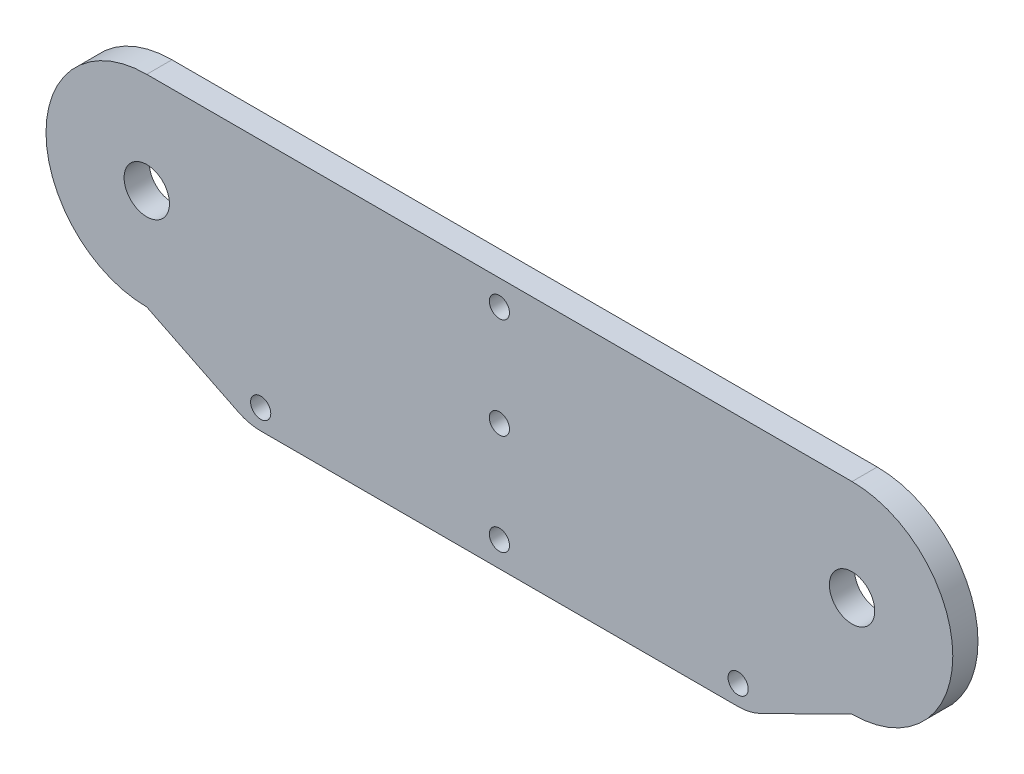
ISO-10303-21;
HEADER;
FILE_DESCRIPTION(('STEP AP214'),'2;1');
FILE_NAME('part.step','',(''),(''),'','','');
FILE_SCHEMA(('AUTOMOTIVE_DESIGN { 1 0 10303 214 1 1 1 1 }'));
ENDSEC;
DATA;
#1=APPLICATION_CONTEXT('core data for automotive mechanical design processes');
#2=APPLICATION_PROTOCOL_DEFINITION('international standard','automotive_design',2000,#1);
#3=PRODUCT_CONTEXT('',#1,'mechanical');
#4=PRODUCT('Part','Part','',(#3));
#5=PRODUCT_RELATED_PRODUCT_CATEGORY('part','',(#4));
#6=PRODUCT_DEFINITION_FORMATION('','',#4);
#7=PRODUCT_DEFINITION_CONTEXT('part definition',#1,'design');
#8=PRODUCT_DEFINITION('design','',#6,#7);
#9=PRODUCT_DEFINITION_SHAPE('','',#8);
#10=(LENGTH_UNIT() NAMED_UNIT(*) SI_UNIT(.MILLI.,.METRE.));
#11=(NAMED_UNIT(*) PLANE_ANGLE_UNIT() SI_UNIT($,.RADIAN.));
#12=(NAMED_UNIT(*) SI_UNIT($,.STERADIAN.) SOLID_ANGLE_UNIT());
#13=UNCERTAINTY_MEASURE_WITH_UNIT(LENGTH_MEASURE(1.E-05),#10,'distance_accuracy_value','');
#14=(GEOMETRIC_REPRESENTATION_CONTEXT(3) GLOBAL_UNCERTAINTY_ASSIGNED_CONTEXT((#13)) GLOBAL_UNIT_ASSIGNED_CONTEXT((#10,
#11,#12)) REPRESENTATION_CONTEXT('',''));
#15=CARTESIAN_POINT('',(0.,0.,0.));
#16=DIRECTION('',(0.,0.,1.));
#17=DIRECTION('',(1.,0.,0.));
#18=AXIS2_PLACEMENT_3D('',#15,#16,#17);
#19=CARTESIAN_POINT('',(35.3056329995053,-71.6141290487414,5.));
#20=DIRECTION('',(0.442182430618627,-0.89692513514351,0.));
#21=DIRECTION('',(0.89692513514351,0.442182430618627,0.));
#22=AXIS2_PLACEMENT_3D('',#19,#20,#21);
#23=PLANE('',#22);
#24=DIRECTION('',(-0.89692513514351,-0.442182430618627,0.));
#25=VECTOR('',#24,1.);
#26=CARTESIAN_POINT('',(35.3056329995053,-71.6141290487414,0.));
#27=LINE('',#26,#25);
#28=CARTESIAN_POINT('',(140.,-19.9999999999995,0.));
#29=VERTEX_POINT('',#28);
#30=CARTESIAN_POINT('',(121.806724049919,-28.969251351435,0.));
#31=VERTEX_POINT('',#30);
#32=EDGE_CURVE('E167',#29,#31,#27,.T.);
#33=ORIENTED_EDGE('',*,*,#32,.F.);
#34=DIRECTION('',(0.,0.,-1.));
#35=VECTOR('',#34,1.);
#36=CARTESIAN_POINT('',(140.,-19.9999999999995,5.));
#37=LINE('',#36,#35);
#38=CARTESIAN_POINT('',(140.,-19.9999999999995,5.));
#39=VERTEX_POINT('',#38);
#40=EDGE_CURVE('E11',#39,#29,#37,.T.);
#41=ORIENTED_EDGE('',*,*,#40,.F.);
#42=DIRECTION('',(-0.89692513514351,-0.442182430618627,0.));
#43=VECTOR('',#42,1.);
#44=CARTESIAN_POINT('',(35.3056329995053,-71.6141290487414,5.));
#45=LINE('',#44,#43);
#46=CARTESIAN_POINT('',(121.806724049919,-28.969251351435,5.));
#47=VERTEX_POINT('',#46);
#48=EDGE_CURVE('E214',#39,#47,#45,.T.);
#49=ORIENTED_EDGE('',*,*,#48,.T.);
#50=DIRECTION('',(0.,0.,-1.));
#51=VECTOR('',#50,1.);
#52=CARTESIAN_POINT('',(121.806724049919,-28.969251351435,5.));
#53=LINE('',#52,#51);
#54=EDGE_CURVE('E98',#47,#31,#53,.T.);
#55=ORIENTED_EDGE('',*,*,#54,.T.);
#56=EDGE_LOOP('',(#33,#41,#49,#55));
#57=FACE_BOUND('',#56,.T.);
#58=ADVANCED_FACE('F47',(#57),#23,.T.);
#59=CARTESIAN_POINT('',(140.,0.,5.));
#60=DIRECTION('',(0.,0.,-1.));
#61=DIRECTION('',(-1.,0.,0.));
#62=AXIS2_PLACEMENT_3D('',#59,#60,#61);
#63=CYLINDRICAL_SURFACE('',#62,20.0000000000002);
#64=CARTESIAN_POINT('',(140.,0.,0.));
#65=DIRECTION('',(0.,0.,1.));
#66=DIRECTION('',(1.,0.,0.));
#67=AXIS2_PLACEMENT_3D('',#64,#65,#66);
#68=CIRCLE('',#67,20.0000000000002);
#69=CARTESIAN_POINT('',(140.,20.0000000000002,0.));
#70=VERTEX_POINT('',#69);
#71=EDGE_CURVE('E171',#70,#29,#68,.F.);
#72=ORIENTED_EDGE('',*,*,#71,.F.);
#73=DIRECTION('',(0.,0.,-1.));
#74=VECTOR('',#73,1.);
#75=CARTESIAN_POINT('',(140.,20.0000000000002,5.));
#76=LINE('',#75,#74);
#77=CARTESIAN_POINT('',(140.,20.0000000000002,5.));
#78=VERTEX_POINT('',#77);
#79=EDGE_CURVE('E56',#78,#70,#76,.T.);
#80=ORIENTED_EDGE('',*,*,#79,.F.);
#81=CARTESIAN_POINT('',(140.,0.,5.));
#82=DIRECTION('',(0.,0.,1.));
#83=DIRECTION('',(1.,0.,0.));
#84=AXIS2_PLACEMENT_3D('',#81,#82,#83);
#85=CIRCLE('',#84,20.0000000000002);
#86=EDGE_CURVE('E254',#78,#39,#85,.F.);
#87=ORIENTED_EDGE('',*,*,#86,.T.);
#88=ORIENTED_EDGE('',*,*,#40,.T.);
#89=EDGE_LOOP('',(#72,#80,#87,#88));
#90=FACE_BOUND('',#89,.T.);
#91=ADVANCED_FACE('F238',(#90),#63,.T.);
#92=CARTESIAN_POINT('',(0.,20.,5.));
#93=DIRECTION('',(0.,1.,0.));
#94=DIRECTION('',(-1.,0.,0.));
#95=AXIS2_PLACEMENT_3D('',#92,#93,#94);
#96=PLANE('',#95);
#97=DIRECTION('',(1.,0.,0.));
#98=VECTOR('',#97,1.);
#99=CARTESIAN_POINT('',(0.,20.,0.));
#100=LINE('',#99,#98);
#101=CARTESIAN_POINT('',(0.,20.,0.));
#102=VERTEX_POINT('',#101);
#103=EDGE_CURVE('E176',#102,#70,#100,.T.);
#104=ORIENTED_EDGE('',*,*,#103,.F.);
#105=DIRECTION('',(0.,0.,-1.));
#106=VECTOR('',#105,1.);
#107=CARTESIAN_POINT('',(0.,20.,5.));
#108=LINE('',#107,#106);
#109=CARTESIAN_POINT('',(0.,20.,5.));
#110=VERTEX_POINT('',#109);
#111=EDGE_CURVE('E225',#110,#102,#108,.T.);
#112=ORIENTED_EDGE('',*,*,#111,.F.);
#113=DIRECTION('',(1.,0.,0.));
#114=VECTOR('',#113,1.);
#115=CARTESIAN_POINT('',(0.,20.,5.));
#116=LINE('',#115,#114);
#117=EDGE_CURVE('E234',#110,#78,#116,.T.);
#118=ORIENTED_EDGE('',*,*,#117,.T.);
#119=ORIENTED_EDGE('',*,*,#79,.T.);
#120=EDGE_LOOP('',(#104,#112,#118,#119));
#121=FACE_BOUND('',#120,.T.);
#122=ADVANCED_FACE('F232',(#121),#96,.T.);
#123=CARTESIAN_POINT('',(0.,0.,5.));
#124=DIRECTION('',(0.,0.,-1.));
#125=DIRECTION('',(-1.,0.,0.));
#126=AXIS2_PLACEMENT_3D('',#123,#124,#125);
#127=CYLINDRICAL_SURFACE('',#126,20.);
#128=CARTESIAN_POINT('',(0.,0.,0.));
#129=DIRECTION('',(0.,0.,1.));
#130=DIRECTION('',(1.,0.,0.));
#131=AXIS2_PLACEMENT_3D('',#128,#129,#130);
#132=CIRCLE('',#131,20.);
#133=CARTESIAN_POINT('',(0.,-20.,0.));
#134=VERTEX_POINT('',#133);
#135=EDGE_CURVE('E180',#102,#134,#132,.T.);
#136=ORIENTED_EDGE('',*,*,#135,.T.);
#137=DIRECTION('',(0.,0.,-1.));
#138=VECTOR('',#137,1.);
#139=CARTESIAN_POINT('',(0.,-20.,5.));
#140=LINE('',#139,#138);
#141=CARTESIAN_POINT('',(0.,-20.,5.));
#142=VERTEX_POINT('',#141);
#143=EDGE_CURVE('E221',#142,#134,#140,.T.);
#144=ORIENTED_EDGE('',*,*,#143,.F.);
#145=CARTESIAN_POINT('',(0.,0.,5.));
#146=DIRECTION('',(0.,0.,1.));
#147=DIRECTION('',(1.,0.,0.));
#148=AXIS2_PLACEMENT_3D('',#145,#146,#147);
#149=CIRCLE('',#148,20.);
#150=EDGE_CURVE('E141',#110,#142,#149,.T.);
#151=ORIENTED_EDGE('',*,*,#150,.F.);
#152=ORIENTED_EDGE('',*,*,#111,.T.);
#153=EDGE_LOOP('',(#136,#144,#151,#152));
#154=FACE_BOUND('',#153,.T.);
#155=ADVANCED_FACE('F246',(#154),#127,.T.);
#156=CARTESIAN_POINT('',(-7.93209072681373,-16.0894939610443,5.));
#157=DIRECTION('',(0.442182430618611,0.896925135143518,0.));
#158=DIRECTION('',(-0.896925135143518,0.442182430618611,0.));
#159=AXIS2_PLACEMENT_3D('',#156,#157,#158);
#160=PLANE('',#159);
#161=DIRECTION('',(0.896925135143518,-0.442182430618611,0.));
#162=VECTOR('',#161,1.);
#163=CARTESIAN_POINT('',(-7.93209072681373,-16.0894939610443,0.));
#164=LINE('',#163,#162);
#165=CARTESIAN_POINT('',(18.1932759500815,-28.9692513514352,0.));
#166=VERTEX_POINT('',#165);
#167=EDGE_CURVE('E183',#134,#166,#164,.T.);
#168=ORIENTED_EDGE('',*,*,#167,.T.);
#169=DIRECTION('',(0.,0.,-1.));
#170=VECTOR('',#169,1.);
#171=CARTESIAN_POINT('',(18.1932759500815,-28.9692513514352,5.));
#172=LINE('',#171,#170);
#173=CARTESIAN_POINT('',(18.1932759500815,-28.9692513514352,5.));
#174=VERTEX_POINT('',#173);
#175=EDGE_CURVE('E126',#174,#166,#172,.T.);
#176=ORIENTED_EDGE('',*,*,#175,.F.);
#177=DIRECTION('',(0.896925135143518,-0.442182430618611,0.));
#178=VECTOR('',#177,1.);
#179=CARTESIAN_POINT('',(-7.93209072681373,-16.0894939610443,5.));
#180=LINE('',#179,#178);
#181=EDGE_CURVE('E136',#142,#174,#180,.T.);
#182=ORIENTED_EDGE('',*,*,#181,.F.);
#183=ORIENTED_EDGE('',*,*,#143,.T.);
#184=EDGE_LOOP('',(#168,#176,#182,#183));
#185=FACE_BOUND('',#184,.T.);
#186=ADVANCED_FACE('F249',(#185),#160,.F.);
#187=CARTESIAN_POINT('',(22.6151002562676,-20.,5.));
#188=DIRECTION('',(0.,0.,-1.));
#189=DIRECTION('',(-1.,0.,0.));
#190=AXIS2_PLACEMENT_3D('',#187,#188,#189);
#191=CYLINDRICAL_SURFACE('',#190,10.);
#192=CARTESIAN_POINT('',(22.6151002562676,-20.,0.));
#193=DIRECTION('',(0.,0.,1.));
#194=DIRECTION('',(1.,0.,0.));
#195=AXIS2_PLACEMENT_3D('',#192,#193,#194);
#196=CIRCLE('',#195,10.);
#197=CARTESIAN_POINT('',(22.6151002562677,-30.,0.));
#198=VERTEX_POINT('',#197);
#199=EDGE_CURVE('E124',#198,#166,#196,.F.);
#200=ORIENTED_EDGE('',*,*,#199,.F.);
#201=DIRECTION('',(0.,0.,-1.));
#202=VECTOR('',#201,1.);
#203=CARTESIAN_POINT('',(22.6151002562677,-30.,5.));
#204=LINE('',#203,#202);
#205=CARTESIAN_POINT('',(22.6151002562677,-30.,5.));
#206=VERTEX_POINT('',#205);
#207=EDGE_CURVE('E118',#206,#198,#204,.T.);
#208=ORIENTED_EDGE('',*,*,#207,.F.);
#209=CARTESIAN_POINT('',(22.6151002562676,-20.,5.));
#210=DIRECTION('',(0.,0.,1.));
#211=DIRECTION('',(1.,0.,0.));
#212=AXIS2_PLACEMENT_3D('',#209,#210,#211);
#213=CIRCLE('',#212,10.);
#214=EDGE_CURVE('E122',#206,#174,#213,.F.);
#215=ORIENTED_EDGE('',*,*,#214,.T.);
#216=ORIENTED_EDGE('',*,*,#175,.T.);
#217=EDGE_LOOP('',(#200,#208,#215,#216));
#218=FACE_BOUND('',#217,.T.);
#219=ADVANCED_FACE('F120',(#218),#191,.T.);
#220=CARTESIAN_POINT('',(1.33989687778435E-13,-30.0000000000001,5.));
#221=DIRECTION('',(0.,1.,0.));
#222=DIRECTION('',(-1.,0.,0.));
#223=AXIS2_PLACEMENT_3D('',#220,#221,#222);
#224=PLANE('',#223);
#225=DIRECTION('',(1.,0.,0.));
#226=VECTOR('',#225,1.);
#227=CARTESIAN_POINT('',(1.33989687778435E-13,-30.0000000000001,0.));
#228=LINE('',#227,#226);
#229=CARTESIAN_POINT('',(117.384899743733,-29.9999999999996,0.));
#230=VERTEX_POINT('',#229);
#231=EDGE_CURVE('E91',#198,#230,#228,.T.);
#232=ORIENTED_EDGE('',*,*,#231,.T.);
#233=DIRECTION('',(0.,0.,-1.));
#234=VECTOR('',#233,1.);
#235=CARTESIAN_POINT('',(117.384899743733,-29.9999999999996,5.));
#236=LINE('',#235,#234);
#237=CARTESIAN_POINT('',(117.384899743733,-29.9999999999996,5.));
#238=VERTEX_POINT('',#237);
#239=EDGE_CURVE('E127',#238,#230,#236,.T.);
#240=ORIENTED_EDGE('',*,*,#239,.F.);
#241=DIRECTION('',(1.,0.,0.));
#242=VECTOR('',#241,1.);
#243=CARTESIAN_POINT('',(1.33989687778435E-13,-30.0000000000001,5.));
#244=LINE('',#243,#242);
#245=EDGE_CURVE('E129',#206,#238,#244,.T.);
#246=ORIENTED_EDGE('',*,*,#245,.F.);
#247=ORIENTED_EDGE('',*,*,#207,.T.);
#248=EDGE_LOOP('',(#232,#240,#246,#247));
#249=FACE_BOUND('',#248,.T.);
#250=ADVANCED_FACE('F130',(#249),#224,.F.);
#251=CARTESIAN_POINT('',(70.,15.,5.));
#252=DIRECTION('',(0.,0.,-1.));
#253=DIRECTION('',(-1.,0.,0.));
#254=AXIS2_PLACEMENT_3D('',#251,#252,#253);
#255=CYLINDRICAL_SURFACE('',#254,2.);
#256=CARTESIAN_POINT('',(70.,15.,5.));
#257=DIRECTION('',(0.,0.,1.));
#258=DIRECTION('',(1.,0.,0.));
#259=AXIS2_PLACEMENT_3D('',#256,#257,#258);
#260=CIRCLE('',#259,2.);
#261=CARTESIAN_POINT('',(72.,15.,5.));
#262=VERTEX_POINT('',#261);
#263=EDGE_CURVE('E159',#262,#262,#260,.T.);
#264=ORIENTED_EDGE('',*,*,#263,.T.);
#265=EDGE_LOOP('',(#264));
#266=FACE_BOUND('',#265,.T.);
#267=CARTESIAN_POINT('',(70.,15.,0.));
#268=DIRECTION('',(0.,0.,1.));
#269=DIRECTION('',(1.,0.,0.));
#270=AXIS2_PLACEMENT_3D('',#267,#268,#269);
#271=CIRCLE('',#270,2.);
#272=CARTESIAN_POINT('',(72.,15.,0.));
#273=VERTEX_POINT('',#272);
#274=EDGE_CURVE('E206',#273,#273,#271,.T.);
#275=ORIENTED_EDGE('',*,*,#274,.F.);
#276=EDGE_LOOP('',(#275));
#277=FACE_BOUND('',#276,.T.);
#278=ADVANCED_FACE('F318',(#266,#277),#255,.F.);
#279=CARTESIAN_POINT('',(70.,-4.99999999999744,5.));
#280=DIRECTION('',(0.,0.,-1.));
#281=DIRECTION('',(-1.,0.,0.));
#282=AXIS2_PLACEMENT_3D('',#279,#280,#281);
#283=CYLINDRICAL_SURFACE('',#282,2.);
#284=CARTESIAN_POINT('',(70.,-4.99999999999744,5.));
#285=DIRECTION('',(0.,0.,1.));
#286=DIRECTION('',(1.,0.,0.));
#287=AXIS2_PLACEMENT_3D('',#284,#285,#286);
#288=CIRCLE('',#287,2.);
#289=CARTESIAN_POINT('',(72.,-4.99999999999744,5.));
#290=VERTEX_POINT('',#289);
#291=EDGE_CURVE('E155',#290,#290,#288,.T.);
#292=ORIENTED_EDGE('',*,*,#291,.T.);
#293=EDGE_LOOP('',(#292));
#294=FACE_BOUND('',#293,.T.);
#295=CARTESIAN_POINT('',(70.,-4.99999999999744,0.));
#296=DIRECTION('',(0.,0.,1.));
#297=DIRECTION('',(1.,0.,0.));
#298=AXIS2_PLACEMENT_3D('',#295,#296,#297);
#299=CIRCLE('',#298,2.);
#300=CARTESIAN_POINT('',(72.,-4.99999999999744,0.));
#301=VERTEX_POINT('',#300);
#302=EDGE_CURVE('E202',#301,#301,#299,.T.);
#303=ORIENTED_EDGE('',*,*,#302,.F.);
#304=EDGE_LOOP('',(#303));
#305=FACE_BOUND('',#304,.T.);
#306=ADVANCED_FACE('F328',(#294,#305),#283,.F.);
#307=CARTESIAN_POINT('',(70.,-25.,5.));
#308=DIRECTION('',(0.,0.,-1.));
#309=DIRECTION('',(-1.,0.,0.));
#310=AXIS2_PLACEMENT_3D('',#307,#308,#309);
#311=CYLINDRICAL_SURFACE('',#310,2.);
#312=CARTESIAN_POINT('',(70.,-25.,5.));
#313=DIRECTION('',(0.,0.,1.));
#314=DIRECTION('',(1.,0.,0.));
#315=AXIS2_PLACEMENT_3D('',#312,#313,#314);
#316=CIRCLE('',#315,2.);
#317=CARTESIAN_POINT('',(72.,-25.,5.));
#318=VERTEX_POINT('',#317);
#319=EDGE_CURVE('E151',#318,#318,#316,.T.);
#320=ORIENTED_EDGE('',*,*,#319,.T.);
#321=EDGE_LOOP('',(#320));
#322=FACE_BOUND('',#321,.T.);
#323=CARTESIAN_POINT('',(70.,-25.,0.));
#324=DIRECTION('',(0.,0.,1.));
#325=DIRECTION('',(1.,0.,0.));
#326=AXIS2_PLACEMENT_3D('',#323,#324,#325);
#327=CIRCLE('',#326,2.);
#328=CARTESIAN_POINT('',(72.,-25.,0.));
#329=VERTEX_POINT('',#328);
#330=EDGE_CURVE('E198',#329,#329,#327,.T.);
#331=ORIENTED_EDGE('',*,*,#330,.F.);
#332=EDGE_LOOP('',(#331));
#333=FACE_BOUND('',#332,.T.);
#334=ADVANCED_FACE('F324',(#322,#333),#311,.F.);
#335=CARTESIAN_POINT('',(140.,0.,5.));
#336=DIRECTION('',(0.,0.,-1.));
#337=DIRECTION('',(-1.,0.,0.));
#338=AXIS2_PLACEMENT_3D('',#335,#336,#337);
#339=CYLINDRICAL_SURFACE('',#338,4.50000000000015);
#340=CARTESIAN_POINT('',(140.,0.,5.));
#341=DIRECTION('',(0.,0.,1.));
#342=DIRECTION('',(1.,0.,0.));
#343=AXIS2_PLACEMENT_3D('',#340,#341,#342);
#344=CIRCLE('',#343,4.50000000000015);
#345=CARTESIAN_POINT('',(144.5,0.,5.));
#346=VERTEX_POINT('',#345);
#347=EDGE_CURVE('E147',#346,#346,#344,.F.);
#348=ORIENTED_EDGE('',*,*,#347,.F.);
#349=EDGE_LOOP('',(#348));
#350=FACE_BOUND('',#349,.T.);
#351=CARTESIAN_POINT('',(140.,0.,0.));
#352=DIRECTION('',(0.,0.,1.));
#353=DIRECTION('',(1.,0.,0.));
#354=AXIS2_PLACEMENT_3D('',#351,#352,#353);
#355=CIRCLE('',#354,4.50000000000015);
#356=CARTESIAN_POINT('',(144.5,0.,0.));
#357=VERTEX_POINT('',#356);
#358=EDGE_CURVE('E194',#357,#357,#355,.F.);
#359=ORIENTED_EDGE('',*,*,#358,.T.);
#360=EDGE_LOOP('',(#359));
#361=FACE_BOUND('',#360,.T.);
#362=ADVANCED_FACE('F321',(#350,#361),#339,.F.);
#363=CARTESIAN_POINT('',(117.384899743733,-19.9999999999996,5.));
#364=DIRECTION('',(0.,0.,-1.));
#365=DIRECTION('',(-1.,0.,0.));
#366=AXIS2_PLACEMENT_3D('',#363,#364,#365);
#367=CYLINDRICAL_SURFACE('',#366,10.0000000000002);
#368=CARTESIAN_POINT('',(117.384899743733,-19.9999999999996,0.));
#369=DIRECTION('',(0.,0.,1.));
#370=DIRECTION('',(1.,0.,0.));
#371=AXIS2_PLACEMENT_3D('',#368,#369,#370);
#372=CIRCLE('',#371,10.0000000000002);
#373=EDGE_CURVE('E191',#230,#31,#372,.T.);
#374=ORIENTED_EDGE('',*,*,#373,.T.);
#375=ORIENTED_EDGE('',*,*,#54,.F.);
#376=CARTESIAN_POINT('',(117.384899743733,-19.9999999999996,5.));
#377=DIRECTION('',(0.,0.,1.));
#378=DIRECTION('',(1.,0.,0.));
#379=AXIS2_PLACEMENT_3D('',#376,#377,#378);
#380=CIRCLE('',#379,10.0000000000002);
#381=EDGE_CURVE('E64',#238,#47,#380,.T.);
#382=ORIENTED_EDGE('',*,*,#381,.F.);
#383=ORIENTED_EDGE('',*,*,#239,.T.);
#384=EDGE_LOOP('',(#374,#375,#382,#383));
#385=FACE_BOUND('',#384,.T.);
#386=ADVANCED_FACE('F252',(#385),#367,.T.);
#387=CARTESIAN_POINT('',(0.,0.,5.));
#388=DIRECTION('',(0.,0.,-1.));
#389=DIRECTION('',(-1.,0.,0.));
#390=AXIS2_PLACEMENT_3D('',#387,#388,#389);
#391=CYLINDRICAL_SURFACE('',#390,4.5);
#392=CARTESIAN_POINT('',(0.,0.,5.));
#393=DIRECTION('',(0.,0.,1.));
#394=DIRECTION('',(1.,0.,0.));
#395=AXIS2_PLACEMENT_3D('',#392,#393,#394);
#396=CIRCLE('',#395,4.5);
#397=CARTESIAN_POINT('',(4.5,0.,5.));
#398=VERTEX_POINT('',#397);
#399=EDGE_CURVE('E163',#398,#398,#396,.T.);
#400=ORIENTED_EDGE('',*,*,#399,.T.);
#401=EDGE_LOOP('',(#400));
#402=FACE_BOUND('',#401,.T.);
#403=CARTESIAN_POINT('',(0.,0.,0.));
#404=DIRECTION('',(0.,0.,1.));
#405=DIRECTION('',(1.,0.,0.));
#406=AXIS2_PLACEMENT_3D('',#403,#404,#405);
#407=CIRCLE('',#406,4.5);
#408=CARTESIAN_POINT('',(4.5,0.,0.));
#409=VERTEX_POINT('',#408);
#410=EDGE_CURVE('E210',#409,#409,#407,.T.);
#411=ORIENTED_EDGE('',*,*,#410,.F.);
#412=EDGE_LOOP('',(#411));
#413=FACE_BOUND('',#412,.T.);
#414=ADVANCED_FACE('F289',(#402,#413),#391,.F.);
#415=CARTESIAN_POINT('',(0.,0.,5.));
#416=DIRECTION('',(0.,0.,1.));
#417=DIRECTION('',(1.,0.,0.));
#418=AXIS2_PLACEMENT_3D('',#415,#416,#417);
#419=PLANE('',#418);
#420=CARTESIAN_POINT('',(22.6151002562676,-26.,5.));
#421=DIRECTION('',(0.,0.,1.));
#422=DIRECTION('',(1.,0.,0.));
#423=AXIS2_PLACEMENT_3D('',#420,#421,#422);
#424=CIRCLE('',#423,2.);
#425=CARTESIAN_POINT('',(24.6151002562676,-26.,5.));
#426=VERTEX_POINT('',#425);
#427=EDGE_CURVE('E270',#426,#426,#424,.T.);
#428=ORIENTED_EDGE('',*,*,#427,.F.);
#429=EDGE_LOOP('',(#428));
#430=FACE_BOUND('',#429,.T.);
#431=CARTESIAN_POINT('',(117.384899743733,-26.,5.));
#432=DIRECTION('',(0.,0.,1.));
#433=DIRECTION('',(1.,0.,0.));
#434=AXIS2_PLACEMENT_3D('',#431,#432,#433);
#435=CIRCLE('',#434,2.);
#436=CARTESIAN_POINT('',(119.384899743733,-26.,5.));
#437=VERTEX_POINT('',#436);
#438=EDGE_CURVE('E266',#437,#437,#435,.T.);
#439=ORIENTED_EDGE('',*,*,#438,.F.);
#440=EDGE_LOOP('',(#439));
#441=FACE_BOUND('',#440,.T.);
#442=ORIENTED_EDGE('',*,*,#48,.F.);
#443=ORIENTED_EDGE('',*,*,#86,.F.);
#444=ORIENTED_EDGE('',*,*,#117,.F.);
#445=ORIENTED_EDGE('',*,*,#150,.T.);
#446=ORIENTED_EDGE('',*,*,#181,.T.);
#447=ORIENTED_EDGE('',*,*,#214,.F.);
#448=ORIENTED_EDGE('',*,*,#245,.T.);
#449=ORIENTED_EDGE('',*,*,#381,.T.);
#450=EDGE_LOOP('',(#442,#443,#444,#445,#446,#447,#448,#449));
#451=FACE_BOUND('',#450,.T.);
#452=ORIENTED_EDGE('',*,*,#347,.T.);
#453=EDGE_LOOP('',(#452));
#454=FACE_BOUND('',#453,.T.);
#455=ORIENTED_EDGE('',*,*,#319,.F.);
#456=EDGE_LOOP('',(#455));
#457=FACE_BOUND('',#456,.T.);
#458=ORIENTED_EDGE('',*,*,#291,.F.);
#459=EDGE_LOOP('',(#458));
#460=FACE_BOUND('',#459,.T.);
#461=ORIENTED_EDGE('',*,*,#263,.F.);
#462=EDGE_LOOP('',(#461));
#463=FACE_BOUND('',#462,.T.);
#464=ORIENTED_EDGE('',*,*,#399,.F.);
#465=EDGE_LOOP('',(#464));
#466=FACE_BOUND('',#465,.T.);
#467=ADVANCED_FACE('F133',(#430,#441,#451,#454,#457,#460,#463,#466),#419,.T.);
#468=CARTESIAN_POINT('',(0.,0.,0.));
#469=DIRECTION('',(0.,0.,1.));
#470=DIRECTION('',(1.,0.,0.));
#471=AXIS2_PLACEMENT_3D('',#468,#469,#470);
#472=PLANE('',#471);
#473=CARTESIAN_POINT('',(22.6151002562676,-26.,0.));
#474=DIRECTION('',(0.,0.,1.));
#475=DIRECTION('',(1.,0.,0.));
#476=AXIS2_PLACEMENT_3D('',#473,#474,#475);
#477=CIRCLE('',#476,2.);
#478=CARTESIAN_POINT('',(24.6151002562676,-26.,0.));
#479=VERTEX_POINT('',#478);
#480=EDGE_CURVE('E172',#479,#479,#477,.T.);
#481=ORIENTED_EDGE('',*,*,#480,.T.);
#482=EDGE_LOOP('',(#481));
#483=FACE_BOUND('',#482,.T.);
#484=CARTESIAN_POINT('',(117.384899743733,-26.,0.));
#485=DIRECTION('',(0.,0.,1.));
#486=DIRECTION('',(1.,0.,0.));
#487=AXIS2_PLACEMENT_3D('',#484,#485,#486);
#488=CIRCLE('',#487,2.);
#489=CARTESIAN_POINT('',(119.384899743733,-26.,0.));
#490=VERTEX_POINT('',#489);
#491=EDGE_CURVE('E259',#490,#490,#488,.T.);
#492=ORIENTED_EDGE('',*,*,#491,.T.);
#493=EDGE_LOOP('',(#492));
#494=FACE_BOUND('',#493,.T.);
#495=ORIENTED_EDGE('',*,*,#32,.T.);
#496=ORIENTED_EDGE('',*,*,#373,.F.);
#497=ORIENTED_EDGE('',*,*,#231,.F.);
#498=ORIENTED_EDGE('',*,*,#199,.T.);
#499=ORIENTED_EDGE('',*,*,#167,.F.);
#500=ORIENTED_EDGE('',*,*,#135,.F.);
#501=ORIENTED_EDGE('',*,*,#103,.T.);
#502=ORIENTED_EDGE('',*,*,#71,.T.);
#503=EDGE_LOOP('',(#495,#496,#497,#498,#499,#500,#501,#502));
#504=FACE_BOUND('',#503,.T.);
#505=ORIENTED_EDGE('',*,*,#358,.F.);
#506=EDGE_LOOP('',(#505));
#507=FACE_BOUND('',#506,.T.);
#508=ORIENTED_EDGE('',*,*,#330,.T.);
#509=EDGE_LOOP('',(#508));
#510=FACE_BOUND('',#509,.T.);
#511=ORIENTED_EDGE('',*,*,#302,.T.);
#512=EDGE_LOOP('',(#511));
#513=FACE_BOUND('',#512,.T.);
#514=ORIENTED_EDGE('',*,*,#274,.T.);
#515=EDGE_LOOP('',(#514));
#516=FACE_BOUND('',#515,.T.);
#517=ORIENTED_EDGE('',*,*,#410,.T.);
#518=EDGE_LOOP('',(#517));
#519=FACE_BOUND('',#518,.T.);
#520=ADVANCED_FACE('F241',(#483,#494,#504,#507,#510,#513,#516,#519),#472,.F.);
#521=CARTESIAN_POINT('',(117.384899743733,-26.,0.));
#522=DIRECTION('',(0.,0.,1.));
#523=DIRECTION('',(1.,0.,0.));
#524=AXIS2_PLACEMENT_3D('',#521,#522,#523);
#525=CYLINDRICAL_SURFACE('',#524,2.);
#526=ORIENTED_EDGE('',*,*,#491,.F.);
#527=EDGE_LOOP('',(#526));
#528=FACE_BOUND('',#527,.T.);
#529=ORIENTED_EDGE('',*,*,#438,.T.);
#530=EDGE_LOOP('',(#529));
#531=FACE_BOUND('',#530,.T.);
#532=ADVANCED_FACE('F283',(#528,#531),#525,.F.);
#533=CARTESIAN_POINT('',(22.6151002562676,-26.,0.));
#534=DIRECTION('',(0.,0.,1.));
#535=DIRECTION('',(1.,0.,0.));
#536=AXIS2_PLACEMENT_3D('',#533,#534,#535);
#537=CYLINDRICAL_SURFACE('',#536,2.);
#538=ORIENTED_EDGE('',*,*,#480,.F.);
#539=EDGE_LOOP('',(#538));
#540=FACE_BOUND('',#539,.T.);
#541=ORIENTED_EDGE('',*,*,#427,.T.);
#542=EDGE_LOOP('',(#541));
#543=FACE_BOUND('',#542,.T.);
#544=ADVANCED_FACE('F280',(#540,#543),#537,.F.);
#545=CLOSED_SHELL('',(#58,#91,#122,#155,#186,#219,#250,#278,#306,#334,#362,#386,#414,#467,#520,
#532,#544));
#546=MANIFOLD_SOLID_BREP('B2',#545);
#547=ADVANCED_BREP_SHAPE_REPRESENTATION('',(#18,#546),#14);
#548=SHAPE_DEFINITION_REPRESENTATION(#9,#547);
ENDSEC;
END-ISO-10303-21;
